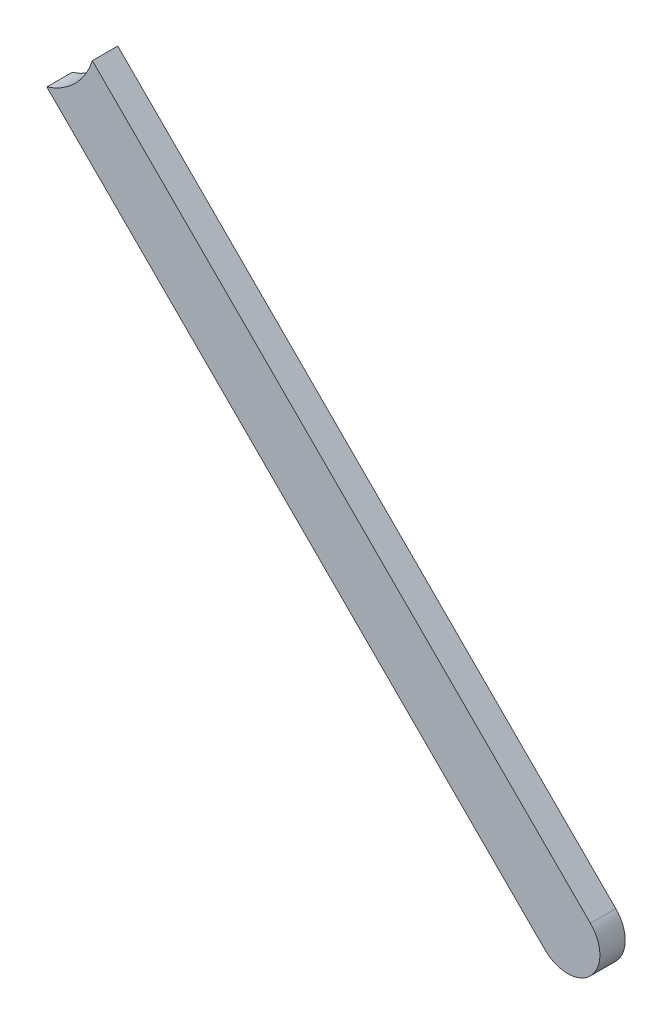
ISO-10303-21;
HEADER;
FILE_DESCRIPTION(('STEP AP214'),'2;1');
FILE_NAME('part.step','',(''),(''),'','','');
FILE_SCHEMA(('AUTOMOTIVE_DESIGN { 1 0 10303 214 1 1 1 1 }'));
ENDSEC;
DATA;
#1=APPLICATION_CONTEXT('core data for automotive mechanical design processes');
#2=APPLICATION_PROTOCOL_DEFINITION('international standard','automotive_design',2000,#1);
#3=PRODUCT_CONTEXT('',#1,'mechanical');
#4=PRODUCT('Part','Part','',(#3));
#5=PRODUCT_RELATED_PRODUCT_CATEGORY('part','',(#4));
#6=PRODUCT_DEFINITION_FORMATION('','',#4);
#7=PRODUCT_DEFINITION_CONTEXT('part definition',#1,'design');
#8=PRODUCT_DEFINITION('design','',#6,#7);
#9=PRODUCT_DEFINITION_SHAPE('','',#8);
#10=(LENGTH_UNIT() NAMED_UNIT(*) SI_UNIT(.MILLI.,.METRE.));
#11=(NAMED_UNIT(*) PLANE_ANGLE_UNIT() SI_UNIT($,.RADIAN.));
#12=(NAMED_UNIT(*) SI_UNIT($,.STERADIAN.) SOLID_ANGLE_UNIT());
#13=UNCERTAINTY_MEASURE_WITH_UNIT(LENGTH_MEASURE(1.E-05),#10,'distance_accuracy_value','');
#14=(GEOMETRIC_REPRESENTATION_CONTEXT(3) GLOBAL_UNCERTAINTY_ASSIGNED_CONTEXT((#13)) GLOBAL_UNIT_ASSIGNED_CONTEXT((#10,
#11,#12)) REPRESENTATION_CONTEXT('',''));
#15=CARTESIAN_POINT('',(0.,0.,0.));
#16=DIRECTION('',(0.,0.,1.));
#17=DIRECTION('',(1.,0.,0.));
#18=AXIS2_PLACEMENT_3D('',#15,#16,#17);
#19=CARTESIAN_POINT('',(129.194064664847,113.390461595153,0.));
#20=DIRECTION('',(0.707106781186549,0.707106781186546,0.));
#21=DIRECTION('',(0.707106781186546,-0.707106781186549,0.));
#22=AXIS2_PLACEMENT_3D('',#19,#20,#21);
#23=PLANE('',#22);
#24=DIRECTION('',(0.707106781186546,-0.707106781186549,0.));
#25=VECTOR('',#24,1.);
#26=CARTESIAN_POINT('',(128.84512966,113.7393966,0.1999996));
#27=LINE('',#26,#25);
#28=CARTESIAN_POINT('',(129.194064664847,113.390461595153,0.1999996));
#29=VERTEX_POINT('',#28);
#30=CARTESIAN_POINT('',(133.1195966,109.46492966,0.1999996));
#31=VERTEX_POINT('',#30);
#32=EDGE_CURVE('E11',#29,#31,#27,.T.);
#33=ORIENTED_EDGE('',*,*,#32,.F.);
#34=DIRECTION('',(0.,0.,1.));
#35=VECTOR('',#34,1.);
#36=CARTESIAN_POINT('',(129.194064664847,113.390461595153,0.));
#37=LINE('',#36,#35);
#38=CARTESIAN_POINT('',(129.194064664847,113.390461595153,0.));
#39=VERTEX_POINT('',#38);
#40=EDGE_CURVE('E24',#39,#29,#37,.T.);
#41=ORIENTED_EDGE('',*,*,#40,.F.);
#42=DIRECTION('',(0.707106781186546,-0.707106781186549,0.));
#43=VECTOR('',#42,1.);
#44=CARTESIAN_POINT('',(128.84512966,113.7393966,0.));
#45=LINE('',#44,#43);
#46=CARTESIAN_POINT('',(133.1195966,109.46492966,0.));
#47=VERTEX_POINT('',#46);
#48=EDGE_CURVE('E75',#39,#47,#45,.T.);
#49=ORIENTED_EDGE('',*,*,#48,.T.);
#50=DIRECTION('',(0.,0.,1.));
#51=VECTOR('',#50,1.);
#52=CARTESIAN_POINT('',(133.1195966,109.46492966,0.));
#53=LINE('',#52,#51);
#54=EDGE_CURVE('E37',#47,#31,#53,.T.);
#55=ORIENTED_EDGE('',*,*,#54,.T.);
#56=EDGE_LOOP('',(#33,#41,#49,#55));
#57=FACE_BOUND('',#56,.T.);
#58=ADVANCED_FACE('F17',(#57),#23,.F.);
#59=CARTESIAN_POINT('',(133.29920127,109.64453433,0.));
#60=DIRECTION('',(0.,0.,-1.));
#61=DIRECTION('',(-0.707106781186548,-0.707106781186548,0.));
#62=AXIS2_PLACEMENT_3D('',#59,#60,#61);
#63=CYLINDRICAL_SURFACE('',#62,0.253999360179546);
#64=CARTESIAN_POINT('',(133.29920127,109.64453433,0.1999996));
#65=DIRECTION('',(0.,0.,1.));
#66=DIRECTION('',(-0.707106781186548,-0.707106781186548,0.));
#67=AXIS2_PLACEMENT_3D('',#64,#65,#66);
#68=CIRCLE('',#67,0.253999360179546);
#69=CARTESIAN_POINT('',(133.47880594,109.824139,0.1999996));
#70=VERTEX_POINT('',#69);
#71=EDGE_CURVE('E83',#31,#70,#68,.T.);
#72=ORIENTED_EDGE('',*,*,#71,.F.);
#73=ORIENTED_EDGE('',*,*,#54,.F.);
#74=CARTESIAN_POINT('',(133.29920127,109.64453433,0.));
#75=DIRECTION('',(0.,0.,1.));
#76=DIRECTION('',(-0.707106781186548,-0.707106781186548,0.));
#77=AXIS2_PLACEMENT_3D('',#74,#75,#76);
#78=CIRCLE('',#77,0.253999360179546);
#79=CARTESIAN_POINT('',(133.47880594,109.824139,0.));
#80=VERTEX_POINT('',#79);
#81=EDGE_CURVE('E81',#47,#80,#78,.T.);
#82=ORIENTED_EDGE('',*,*,#81,.T.);
#83=DIRECTION('',(0.,0.,1.));
#84=VECTOR('',#83,1.);
#85=CARTESIAN_POINT('',(133.47880594,109.824139,0.));
#86=LINE('',#85,#84);
#87=EDGE_CURVE('E67',#80,#70,#86,.T.);
#88=ORIENTED_EDGE('',*,*,#87,.T.);
#89=EDGE_LOOP('',(#72,#73,#82,#88));
#90=FACE_BOUND('',#89,.T.);
#91=ADVANCED_FACE('F89',(#90),#63,.T.);
#92=CARTESIAN_POINT('',(133.47880594,109.824139,0.));
#93=DIRECTION('',(-0.707106781186545,-0.70710678118655,0.));
#94=DIRECTION('',(-0.70710678118655,0.707106781186545,0.));
#95=AXIS2_PLACEMENT_3D('',#92,#93,#94);
#96=PLANE('',#95);
#97=DIRECTION('',(-0.70710678118655,0.707106781186545,0.));
#98=VECTOR('',#97,1.);
#99=CARTESIAN_POINT('',(133.47880594,109.824139,0.1999996));
#100=LINE('',#99,#98);
#101=CARTESIAN_POINT('',(129.553274004847,113.749670935153,0.1999996));
#102=VERTEX_POINT('',#101);
#103=EDGE_CURVE('E71',#70,#102,#100,.T.);
#104=ORIENTED_EDGE('',*,*,#103,.F.);
#105=ORIENTED_EDGE('',*,*,#87,.F.);
#106=DIRECTION('',(-0.70710678118655,0.707106781186545,0.));
#107=VECTOR('',#106,1.);
#108=CARTESIAN_POINT('',(133.47880594,109.824139,0.));
#109=LINE('',#108,#107);
#110=CARTESIAN_POINT('',(129.553274004847,113.749670935153,0.));
#111=VERTEX_POINT('',#110);
#112=EDGE_CURVE('E63',#80,#111,#109,.T.);
#113=ORIENTED_EDGE('',*,*,#112,.T.);
#114=DIRECTION('',(0.,0.,1.));
#115=VECTOR('',#114,1.);
#116=CARTESIAN_POINT('',(129.553274004847,113.749670935153,0.));
#117=LINE('',#116,#115);
#118=EDGE_CURVE('E53',#111,#102,#117,.T.);
#119=ORIENTED_EDGE('',*,*,#118,.T.);
#120=EDGE_LOOP('',(#104,#105,#113,#119));
#121=FACE_BOUND('',#120,.T.);
#122=ADVANCED_FACE('F66',(#121),#96,.F.);
#123=CARTESIAN_POINT('',(129.0247356,113.919,0.));
#124=DIRECTION('',(0.,0.,-1.));
#125=DIRECTION('',(1.,0.,0.));
#126=AXIS2_PLACEMENT_3D('',#123,#124,#125);
#127=CYLINDRICAL_SURFACE('',#126,0.55500016);
#128=ORIENTED_EDGE('',*,*,#40,.T.);
#129=CARTESIAN_POINT('',(129.0247356,113.919,0.1999996));
#130=DIRECTION('',(0.,0.,1.));
#131=DIRECTION('',(1.,0.,0.));
#132=AXIS2_PLACEMENT_3D('',#129,#130,#131);
#133=CIRCLE('',#132,0.55500016);
#134=EDGE_CURVE('E59',#29,#102,#133,.T.);
#135=ORIENTED_EDGE('',*,*,#134,.T.);
#136=ORIENTED_EDGE('',*,*,#118,.F.);
#137=CARTESIAN_POINT('',(129.0247356,113.919,0.));
#138=DIRECTION('',(0.,0.,1.));
#139=DIRECTION('',(1.,0.,0.));
#140=AXIS2_PLACEMENT_3D('',#137,#138,#139);
#141=CIRCLE('',#140,0.55500016);
#142=EDGE_CURVE('E57',#39,#111,#141,.T.);
#143=ORIENTED_EDGE('',*,*,#142,.F.);
#144=EDGE_LOOP('',(#128,#135,#136,#143));
#145=FACE_BOUND('',#144,.T.);
#146=ADVANCED_FACE('F55',(#145),#127,.F.);
#147=CARTESIAN_POINT('',(128.84512966,113.7393966,0.));
#148=DIRECTION('',(0.,0.,-1.));
#149=DIRECTION('',(-1.,0.,0.));
#150=AXIS2_PLACEMENT_3D('',#147,#148,#149);
#151=PLANE('',#150);
#152=ORIENTED_EDGE('',*,*,#48,.F.);
#153=ORIENTED_EDGE('',*,*,#142,.T.);
#154=ORIENTED_EDGE('',*,*,#112,.F.);
#155=ORIENTED_EDGE('',*,*,#81,.F.);
#156=EDGE_LOOP('',(#152,#153,#154,#155));
#157=FACE_BOUND('',#156,.T.);
#158=ADVANCED_FACE('F74',(#157),#151,.T.);
#159=CARTESIAN_POINT('',(128.84512966,113.7393966,0.1999996));
#160=DIRECTION('',(0.,0.,-1.));
#161=DIRECTION('',(-1.,0.,0.));
#162=AXIS2_PLACEMENT_3D('',#159,#160,#161);
#163=PLANE('',#162);
#164=ORIENTED_EDGE('',*,*,#134,.F.);
#165=ORIENTED_EDGE('',*,*,#32,.T.);
#166=ORIENTED_EDGE('',*,*,#71,.T.);
#167=ORIENTED_EDGE('',*,*,#103,.T.);
#168=EDGE_LOOP('',(#164,#165,#166,#167));
#169=FACE_BOUND('',#168,.T.);
#170=ADVANCED_FACE('F91',(#169),#163,.F.);
#171=CLOSED_SHELL('',(#58,#91,#122,#146,#158,#170));
#172=MANIFOLD_SOLID_BREP('B1',#171);
#173=ADVANCED_BREP_SHAPE_REPRESENTATION('',(#18,#172),#14);
#174=SHAPE_DEFINITION_REPRESENTATION(#9,#173);
ENDSEC;
END-ISO-10303-21;
